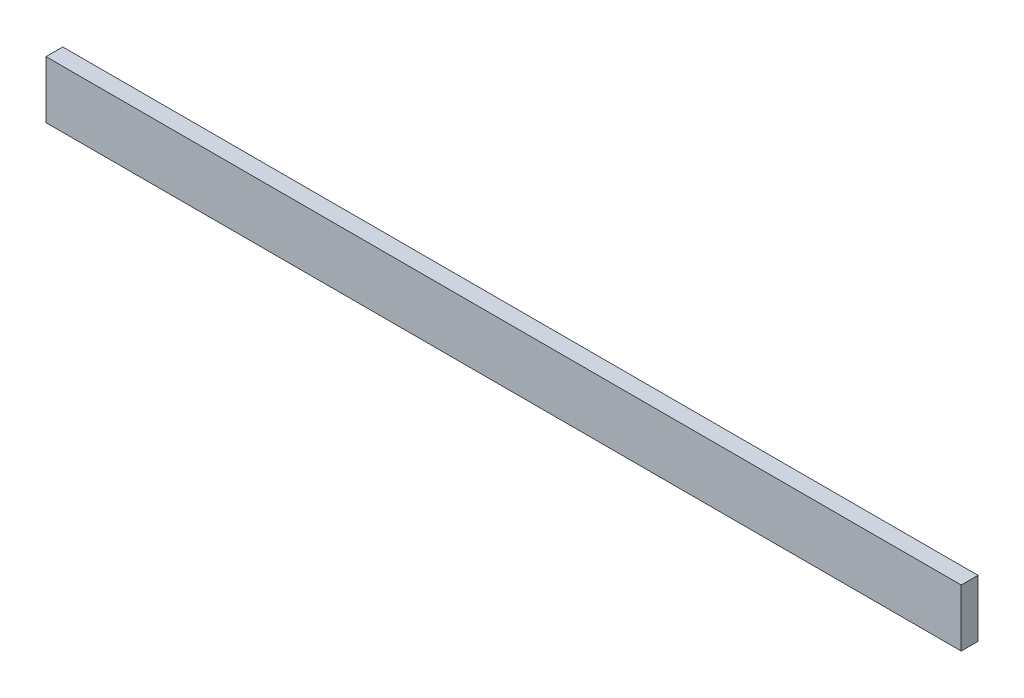
ISO-10303-21;
HEADER;
FILE_DESCRIPTION(('STEP AP214'),'2;1');
FILE_NAME('part.step','',(''),(''),'','','');
FILE_SCHEMA(('AUTOMOTIVE_DESIGN { 1 0 10303 214 1 1 1 1 }'));
ENDSEC;
DATA;
#1=APPLICATION_CONTEXT('core data for automotive mechanical design processes');
#2=APPLICATION_PROTOCOL_DEFINITION('international standard','automotive_design',2000,#1);
#3=PRODUCT_CONTEXT('',#1,'mechanical');
#4=PRODUCT('Part','Part','',(#3));
#5=PRODUCT_RELATED_PRODUCT_CATEGORY('part','',(#4));
#6=PRODUCT_DEFINITION_FORMATION('','',#4);
#7=PRODUCT_DEFINITION_CONTEXT('part definition',#1,'design');
#8=PRODUCT_DEFINITION('design','',#6,#7);
#9=PRODUCT_DEFINITION_SHAPE('','',#8);
#10=(LENGTH_UNIT() NAMED_UNIT(*) SI_UNIT(.MILLI.,.METRE.));
#11=(NAMED_UNIT(*) PLANE_ANGLE_UNIT() SI_UNIT($,.RADIAN.));
#12=(NAMED_UNIT(*) SI_UNIT($,.STERADIAN.) SOLID_ANGLE_UNIT());
#13=UNCERTAINTY_MEASURE_WITH_UNIT(LENGTH_MEASURE(1.E-05),#10,'distance_accuracy_value','');
#14=(GEOMETRIC_REPRESENTATION_CONTEXT(3) GLOBAL_UNCERTAINTY_ASSIGNED_CONTEXT((#13)) GLOBAL_UNIT_ASSIGNED_CONTEXT((#10,
#11,#12)) REPRESENTATION_CONTEXT('',''));
#15=CARTESIAN_POINT('',(0.,0.,0.));
#16=DIRECTION('',(0.,0.,1.));
#17=DIRECTION('',(1.,0.,0.));
#18=AXIS2_PLACEMENT_3D('',#15,#16,#17);
#19=CARTESIAN_POINT('',(152.4,-9.525,5.588));
#20=DIRECTION('',(-1.,0.,0.));
#21=DIRECTION('',(0.,0.,1.));
#22=AXIS2_PLACEMENT_3D('',#19,#20,#21);
#23=PLANE('',#22);
#24=DIRECTION('',(0.,1.,0.));
#25=VECTOR('',#24,1.);
#26=CARTESIAN_POINT('',(152.4,-9.525,0.));
#27=LINE('',#26,#25);
#28=CARTESIAN_POINT('',(152.4,-9.525,0.));
#29=VERTEX_POINT('',#28);
#30=CARTESIAN_POINT('',(152.4,9.525,0.));
#31=VERTEX_POINT('',#30);
#32=EDGE_CURVE('E107',#29,#31,#27,.T.);
#33=ORIENTED_EDGE('',*,*,#32,.T.);
#34=DIRECTION('',(0.,0.,-1.));
#35=VECTOR('',#34,1.);
#36=CARTESIAN_POINT('',(152.4,9.525,5.588));
#37=LINE('',#36,#35);
#38=CARTESIAN_POINT('',(152.4,9.525,5.588));
#39=VERTEX_POINT('',#38);
#40=EDGE_CURVE('E11',#39,#31,#37,.T.);
#41=ORIENTED_EDGE('',*,*,#40,.F.);
#42=DIRECTION('',(0.,1.,0.));
#43=VECTOR('',#42,1.);
#44=CARTESIAN_POINT('',(152.4,-9.525,5.588));
#45=LINE('',#44,#43);
#46=CARTESIAN_POINT('',(152.4,-9.525,5.588));
#47=VERTEX_POINT('',#46);
#48=EDGE_CURVE('E91',#47,#39,#45,.T.);
#49=ORIENTED_EDGE('',*,*,#48,.F.);
#50=DIRECTION('',(0.,0.,-1.));
#51=VECTOR('',#50,1.);
#52=CARTESIAN_POINT('',(152.4,-9.525,5.588));
#53=LINE('',#52,#51);
#54=EDGE_CURVE('E103',#47,#29,#53,.T.);
#55=ORIENTED_EDGE('',*,*,#54,.T.);
#56=EDGE_LOOP('',(#33,#41,#49,#55));
#57=FACE_BOUND('',#56,.T.);
#58=ADVANCED_FACE('F39',(#57),#23,.F.);
#59=CARTESIAN_POINT('',(-152.4,9.525,5.588));
#60=DIRECTION('',(0.,-1.,0.));
#61=DIRECTION('',(0.,0.,-1.));
#62=AXIS2_PLACEMENT_3D('',#59,#60,#61);
#63=PLANE('',#62);
#64=DIRECTION('',(-1.,0.,0.));
#65=VECTOR('',#64,1.);
#66=CARTESIAN_POINT('',(-152.4,9.525,0.));
#67=LINE('',#66,#65);
#68=CARTESIAN_POINT('',(-152.4,9.525,0.));
#69=VERTEX_POINT('',#68);
#70=EDGE_CURVE('E96',#31,#69,#67,.T.);
#71=ORIENTED_EDGE('',*,*,#70,.T.);
#72=DIRECTION('',(0.,0.,-1.));
#73=VECTOR('',#72,1.);
#74=CARTESIAN_POINT('',(-152.4,9.525,5.588));
#75=LINE('',#74,#73);
#76=CARTESIAN_POINT('',(-152.4,9.525,5.588));
#77=VERTEX_POINT('',#76);
#78=EDGE_CURVE('E48',#77,#69,#75,.T.);
#79=ORIENTED_EDGE('',*,*,#78,.F.);
#80=DIRECTION('',(-1.,0.,0.));
#81=VECTOR('',#80,1.);
#82=CARTESIAN_POINT('',(-152.4,9.525,5.588));
#83=LINE('',#82,#81);
#84=EDGE_CURVE('E86',#39,#77,#83,.T.);
#85=ORIENTED_EDGE('',*,*,#84,.F.);
#86=ORIENTED_EDGE('',*,*,#40,.T.);
#87=EDGE_LOOP('',(#71,#79,#85,#86));
#88=FACE_BOUND('',#87,.T.);
#89=ADVANCED_FACE('F95',(#88),#63,.F.);
#90=CARTESIAN_POINT('',(-152.4,-9.525,5.588));
#91=DIRECTION('',(1.,0.,0.));
#92=DIRECTION('',(0.,0.,-1.));
#93=AXIS2_PLACEMENT_3D('',#90,#91,#92);
#94=PLANE('',#93);
#95=DIRECTION('',(0.,-1.,0.));
#96=VECTOR('',#95,1.);
#97=CARTESIAN_POINT('',(-152.4,-9.525,0.));
#98=LINE('',#97,#96);
#99=CARTESIAN_POINT('',(-152.4,-9.525,0.));
#100=VERTEX_POINT('',#99);
#101=EDGE_CURVE('E73',#69,#100,#98,.T.);
#102=ORIENTED_EDGE('',*,*,#101,.T.);
#103=DIRECTION('',(0.,0.,-1.));
#104=VECTOR('',#103,1.);
#105=CARTESIAN_POINT('',(-152.4,-9.525,5.588));
#106=LINE('',#105,#104);
#107=CARTESIAN_POINT('',(-152.4,-9.525,5.588));
#108=VERTEX_POINT('',#107);
#109=EDGE_CURVE('E98',#108,#100,#106,.T.);
#110=ORIENTED_EDGE('',*,*,#109,.F.);
#111=DIRECTION('',(0.,-1.,0.));
#112=VECTOR('',#111,1.);
#113=CARTESIAN_POINT('',(-152.4,-9.525,5.588));
#114=LINE('',#113,#112);
#115=EDGE_CURVE('E89',#77,#108,#114,.T.);
#116=ORIENTED_EDGE('',*,*,#115,.F.);
#117=ORIENTED_EDGE('',*,*,#78,.T.);
#118=EDGE_LOOP('',(#102,#110,#116,#117));
#119=FACE_BOUND('',#118,.T.);
#120=ADVANCED_FACE('F99',(#119),#94,.F.);
#121=CARTESIAN_POINT('',(-152.4,-9.525,5.588));
#122=DIRECTION('',(0.,1.,0.));
#123=DIRECTION('',(0.,0.,1.));
#124=AXIS2_PLACEMENT_3D('',#121,#122,#123);
#125=PLANE('',#124);
#126=DIRECTION('',(1.,0.,0.));
#127=VECTOR('',#126,1.);
#128=CARTESIAN_POINT('',(-152.4,-9.525,0.));
#129=LINE('',#128,#127);
#130=EDGE_CURVE('E79',#100,#29,#129,.T.);
#131=ORIENTED_EDGE('',*,*,#130,.T.);
#132=ORIENTED_EDGE('',*,*,#54,.F.);
#133=DIRECTION('',(1.,0.,0.));
#134=VECTOR('',#133,1.);
#135=CARTESIAN_POINT('',(-152.4,-9.525,5.588));
#136=LINE('',#135,#134);
#137=EDGE_CURVE('E56',#108,#47,#136,.T.);
#138=ORIENTED_EDGE('',*,*,#137,.F.);
#139=ORIENTED_EDGE('',*,*,#109,.T.);
#140=EDGE_LOOP('',(#131,#132,#138,#139));
#141=FACE_BOUND('',#140,.T.);
#142=ADVANCED_FACE('F120',(#141),#125,.F.);
#143=CARTESIAN_POINT('',(0.,0.,5.588));
#144=DIRECTION('',(0.,0.,-1.));
#145=DIRECTION('',(-1.,0.,0.));
#146=AXIS2_PLACEMENT_3D('',#143,#144,#145);
#147=PLANE('',#146);
#148=ORIENTED_EDGE('',*,*,#48,.T.);
#149=ORIENTED_EDGE('',*,*,#84,.T.);
#150=ORIENTED_EDGE('',*,*,#115,.T.);
#151=ORIENTED_EDGE('',*,*,#137,.T.);
#152=EDGE_LOOP('',(#148,#149,#150,#151));
#153=FACE_BOUND('',#152,.T.);
#154=ADVANCED_FACE('F87',(#153),#147,.F.);
#155=CARTESIAN_POINT('',(0.,0.,0.));
#156=DIRECTION('',(0.,0.,-1.));
#157=DIRECTION('',(-1.,0.,0.));
#158=AXIS2_PLACEMENT_3D('',#155,#156,#157);
#159=PLANE('',#158);
#160=ORIENTED_EDGE('',*,*,#32,.F.);
#161=ORIENTED_EDGE('',*,*,#130,.F.);
#162=ORIENTED_EDGE('',*,*,#101,.F.);
#163=ORIENTED_EDGE('',*,*,#70,.F.);
#164=EDGE_LOOP('',(#160,#161,#162,#163));
#165=FACE_BOUND('',#164,.T.);
#166=ADVANCED_FACE('F123',(#165),#159,.T.);
#167=CLOSED_SHELL('',(#58,#89,#120,#142,#154,#166));
#168=MANIFOLD_SOLID_BREP('B2',#167);
#169=ADVANCED_BREP_SHAPE_REPRESENTATION('',(#18,#168),#14);
#170=SHAPE_DEFINITION_REPRESENTATION(#9,#169);
ENDSEC;
END-ISO-10303-21;
